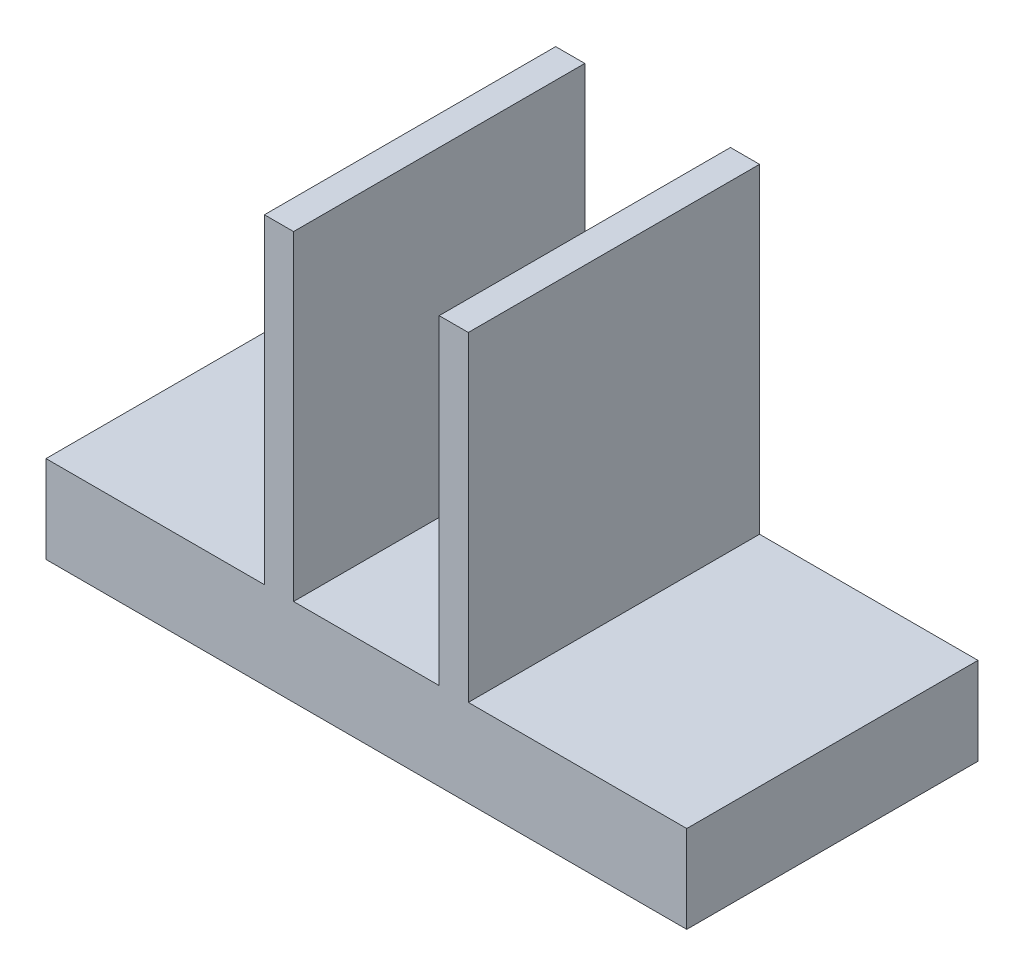
ISO-10303-21;
HEADER;
FILE_DESCRIPTION(('STEP AP214'),'2;1');
FILE_NAME('part.step','',(''),(''),'','','');
FILE_SCHEMA(('AUTOMOTIVE_DESIGN { 1 0 10303 214 1 1 1 1 }'));
ENDSEC;
DATA;
#1=APPLICATION_CONTEXT('core data for automotive mechanical design processes');
#2=APPLICATION_PROTOCOL_DEFINITION('international standard','automotive_design',2000,#1);
#3=PRODUCT_CONTEXT('',#1,'mechanical');
#4=PRODUCT('Part','Part','',(#3));
#5=PRODUCT_RELATED_PRODUCT_CATEGORY('part','',(#4));
#6=PRODUCT_DEFINITION_FORMATION('','',#4);
#7=PRODUCT_DEFINITION_CONTEXT('part definition',#1,'design');
#8=PRODUCT_DEFINITION('design','',#6,#7);
#9=PRODUCT_DEFINITION_SHAPE('','',#8);
#10=(LENGTH_UNIT() NAMED_UNIT(*) SI_UNIT(.MILLI.,.METRE.));
#11=(NAMED_UNIT(*) PLANE_ANGLE_UNIT() SI_UNIT($,.RADIAN.));
#12=(NAMED_UNIT(*) SI_UNIT($,.STERADIAN.) SOLID_ANGLE_UNIT());
#13=UNCERTAINTY_MEASURE_WITH_UNIT(LENGTH_MEASURE(1.E-05),#10,'distance_accuracy_value','');
#14=(GEOMETRIC_REPRESENTATION_CONTEXT(3) GLOBAL_UNCERTAINTY_ASSIGNED_CONTEXT((#13)) GLOBAL_UNIT_ASSIGNED_CONTEXT((#10,
#11,#12)) REPRESENTATION_CONTEXT('',''));
#15=CARTESIAN_POINT('',(0.,0.,0.));
#16=DIRECTION('',(0.,0.,1.));
#17=DIRECTION('',(1.,0.,0.));
#18=AXIS2_PLACEMENT_3D('',#15,#16,#17);
#19=CARTESIAN_POINT('',(0.,0.,10.));
#20=DIRECTION('',(1.,0.,0.));
#21=DIRECTION('',(0.,0.,-1.));
#22=AXIS2_PLACEMENT_3D('',#19,#20,#21);
#23=PLANE('',#22);
#24=DIRECTION('',(0.,-1.,0.));
#25=VECTOR('',#24,1.);
#26=CARTESIAN_POINT('',(0.,0.,0.));
#27=LINE('',#26,#25);
#28=CARTESIAN_POINT('',(0.,3.,0.));
#29=VERTEX_POINT('',#28);
#30=CARTESIAN_POINT('',(0.,0.,0.));
#31=VERTEX_POINT('',#30);
#32=EDGE_CURVE('E163',#29,#31,#27,.T.);
#33=ORIENTED_EDGE('',*,*,#32,.T.);
#34=DIRECTION('',(0.,0.,-1.));
#35=VECTOR('',#34,1.);
#36=CARTESIAN_POINT('',(0.,0.,10.));
#37=LINE('',#36,#35);
#38=CARTESIAN_POINT('',(0.,0.,10.));
#39=VERTEX_POINT('',#38);
#40=EDGE_CURVE('E11',#39,#31,#37,.T.);
#41=ORIENTED_EDGE('',*,*,#40,.F.);
#42=DIRECTION('',(0.,-1.,0.));
#43=VECTOR('',#42,1.);
#44=CARTESIAN_POINT('',(0.,0.,10.));
#45=LINE('',#44,#43);
#46=CARTESIAN_POINT('',(0.,3.,10.));
#47=VERTEX_POINT('',#46);
#48=EDGE_CURVE('E185',#47,#39,#45,.T.);
#49=ORIENTED_EDGE('',*,*,#48,.F.);
#50=DIRECTION('',(0.,0.,-1.));
#51=VECTOR('',#50,1.);
#52=CARTESIAN_POINT('',(0.,3.,10.));
#53=LINE('',#52,#51);
#54=EDGE_CURVE('E159',#47,#29,#53,.T.);
#55=ORIENTED_EDGE('',*,*,#54,.T.);
#56=EDGE_LOOP('',(#33,#41,#49,#55));
#57=FACE_BOUND('',#56,.T.);
#58=ADVANCED_FACE('F43',(#57),#23,.F.);
#59=CARTESIAN_POINT('',(0.,0.,10.));
#60=DIRECTION('',(0.,1.,0.));
#61=DIRECTION('',(0.,0.,1.));
#62=AXIS2_PLACEMENT_3D('',#59,#60,#61);
#63=PLANE('',#62);
#64=DIRECTION('',(1.,0.,0.));
#65=VECTOR('',#64,1.);
#66=CARTESIAN_POINT('',(0.,0.,0.));
#67=LINE('',#66,#65);
#68=CARTESIAN_POINT('',(22.,0.,0.));
#69=VERTEX_POINT('',#68);
#70=EDGE_CURVE('E166',#31,#69,#67,.T.);
#71=ORIENTED_EDGE('',*,*,#70,.T.);
#72=DIRECTION('',(0.,0.,-1.));
#73=VECTOR('',#72,1.);
#74=CARTESIAN_POINT('',(22.,0.,10.));
#75=LINE('',#74,#73);
#76=CARTESIAN_POINT('',(22.,0.,10.));
#77=VERTEX_POINT('',#76);
#78=EDGE_CURVE('E51',#77,#69,#75,.T.);
#79=ORIENTED_EDGE('',*,*,#78,.F.);
#80=DIRECTION('',(1.,0.,0.));
#81=VECTOR('',#80,1.);
#82=CARTESIAN_POINT('',(0.,0.,10.));
#83=LINE('',#82,#81);
#84=EDGE_CURVE('E114',#39,#77,#83,.T.);
#85=ORIENTED_EDGE('',*,*,#84,.F.);
#86=ORIENTED_EDGE('',*,*,#40,.T.);
#87=EDGE_LOOP('',(#71,#79,#85,#86));
#88=FACE_BOUND('',#87,.T.);
#89=ADVANCED_FACE('F263',(#88),#63,.F.);
#90=CARTESIAN_POINT('',(22.,0.,10.));
#91=DIRECTION('',(-1.,0.,0.));
#92=DIRECTION('',(0.,0.,1.));
#93=AXIS2_PLACEMENT_3D('',#90,#91,#92);
#94=PLANE('',#93);
#95=DIRECTION('',(0.,1.,0.));
#96=VECTOR('',#95,1.);
#97=CARTESIAN_POINT('',(22.,0.,0.));
#98=LINE('',#97,#96);
#99=CARTESIAN_POINT('',(22.,3.,0.));
#100=VERTEX_POINT('',#99);
#101=EDGE_CURVE('E168',#69,#100,#98,.T.);
#102=ORIENTED_EDGE('',*,*,#101,.T.);
#103=DIRECTION('',(0.,0.,-1.));
#104=VECTOR('',#103,1.);
#105=CARTESIAN_POINT('',(22.,3.,10.));
#106=LINE('',#105,#104);
#107=CARTESIAN_POINT('',(22.,3.,10.));
#108=VERTEX_POINT('',#107);
#109=EDGE_CURVE('E204',#108,#100,#106,.T.);
#110=ORIENTED_EDGE('',*,*,#109,.F.);
#111=DIRECTION('',(0.,1.,0.));
#112=VECTOR('',#111,1.);
#113=CARTESIAN_POINT('',(22.,0.,10.));
#114=LINE('',#113,#112);
#115=EDGE_CURVE('E212',#77,#108,#114,.T.);
#116=ORIENTED_EDGE('',*,*,#115,.F.);
#117=ORIENTED_EDGE('',*,*,#78,.T.);
#118=EDGE_LOOP('',(#102,#110,#116,#117));
#119=FACE_BOUND('',#118,.T.);
#120=ADVANCED_FACE('F210',(#119),#94,.F.);
#121=CARTESIAN_POINT('',(22.,3.,10.));
#122=DIRECTION('',(0.,-1.,0.));
#123=DIRECTION('',(1.,0.,0.));
#124=AXIS2_PLACEMENT_3D('',#121,#122,#123);
#125=PLANE('',#124);
#126=DIRECTION('',(-1.,0.,0.));
#127=VECTOR('',#126,1.);
#128=CARTESIAN_POINT('',(22.,3.,0.));
#129=LINE('',#128,#127);
#130=CARTESIAN_POINT('',(14.5,3.,0.));
#131=VERTEX_POINT('',#130);
#132=EDGE_CURVE('E170',#100,#131,#129,.T.);
#133=ORIENTED_EDGE('',*,*,#132,.T.);
#134=DIRECTION('',(0.,0.,-1.));
#135=VECTOR('',#134,1.);
#136=CARTESIAN_POINT('',(14.5,3.,10.));
#137=LINE('',#136,#135);
#138=CARTESIAN_POINT('',(14.5,3.,10.));
#139=VERTEX_POINT('',#138);
#140=EDGE_CURVE('E201',#139,#131,#137,.T.);
#141=ORIENTED_EDGE('',*,*,#140,.F.);
#142=DIRECTION('',(-1.,0.,0.));
#143=VECTOR('',#142,1.);
#144=CARTESIAN_POINT('',(22.,3.,10.));
#145=LINE('',#144,#143);
#146=EDGE_CURVE('E230',#108,#139,#145,.T.);
#147=ORIENTED_EDGE('',*,*,#146,.F.);
#148=ORIENTED_EDGE('',*,*,#109,.T.);
#149=EDGE_LOOP('',(#133,#141,#147,#148));
#150=FACE_BOUND('',#149,.T.);
#151=ADVANCED_FACE('F221',(#150),#125,.F.);
#152=CARTESIAN_POINT('',(14.5,3.,10.));
#153=DIRECTION('',(-1.,0.,0.));
#154=DIRECTION('',(0.,0.,1.));
#155=AXIS2_PLACEMENT_3D('',#152,#153,#154);
#156=PLANE('',#155);
#157=DIRECTION('',(0.,1.,0.));
#158=VECTOR('',#157,1.);
#159=CARTESIAN_POINT('',(14.5,3.,0.));
#160=LINE('',#159,#158);
#161=CARTESIAN_POINT('',(14.5,14.,0.));
#162=VERTEX_POINT('',#161);
#163=EDGE_CURVE('E172',#131,#162,#160,.T.);
#164=ORIENTED_EDGE('',*,*,#163,.T.);
#165=DIRECTION('',(0.,0.,-1.));
#166=VECTOR('',#165,1.);
#167=CARTESIAN_POINT('',(14.5,14.,10.));
#168=LINE('',#167,#166);
#169=CARTESIAN_POINT('',(14.5,14.,10.));
#170=VERTEX_POINT('',#169);
#171=EDGE_CURVE('E198',#170,#162,#168,.T.);
#172=ORIENTED_EDGE('',*,*,#171,.F.);
#173=DIRECTION('',(0.,1.,0.));
#174=VECTOR('',#173,1.);
#175=CARTESIAN_POINT('',(14.5,3.,10.));
#176=LINE('',#175,#174);
#177=EDGE_CURVE('E227',#139,#170,#176,.T.);
#178=ORIENTED_EDGE('',*,*,#177,.F.);
#179=ORIENTED_EDGE('',*,*,#140,.T.);
#180=EDGE_LOOP('',(#164,#172,#178,#179));
#181=FACE_BOUND('',#180,.T.);
#182=ADVANCED_FACE('F225',(#181),#156,.F.);
#183=CARTESIAN_POINT('',(14.5,14.,10.));
#184=DIRECTION('',(0.,-1.,0.));
#185=DIRECTION('',(0.,0.,-1.));
#186=AXIS2_PLACEMENT_3D('',#183,#184,#185);
#187=PLANE('',#186);
#188=DIRECTION('',(-1.,0.,0.));
#189=VECTOR('',#188,1.);
#190=CARTESIAN_POINT('',(14.5,14.,0.));
#191=LINE('',#190,#189);
#192=CARTESIAN_POINT('',(13.5,14.,0.));
#193=VERTEX_POINT('',#192);
#194=EDGE_CURVE('E174',#162,#193,#191,.T.);
#195=ORIENTED_EDGE('',*,*,#194,.T.);
#196=DIRECTION('',(0.,0.,-1.));
#197=VECTOR('',#196,1.);
#198=CARTESIAN_POINT('',(13.5,14.,10.));
#199=LINE('',#198,#197);
#200=CARTESIAN_POINT('',(13.5,14.,10.));
#201=VERTEX_POINT('',#200);
#202=EDGE_CURVE('E195',#201,#193,#199,.T.);
#203=ORIENTED_EDGE('',*,*,#202,.F.);
#204=DIRECTION('',(-1.,0.,0.));
#205=VECTOR('',#204,1.);
#206=CARTESIAN_POINT('',(14.5,14.,10.));
#207=LINE('',#206,#205);
#208=EDGE_CURVE('E229',#170,#201,#207,.T.);
#209=ORIENTED_EDGE('',*,*,#208,.F.);
#210=ORIENTED_EDGE('',*,*,#171,.T.);
#211=EDGE_LOOP('',(#195,#203,#209,#210));
#212=FACE_BOUND('',#211,.T.);
#213=ADVANCED_FACE('F276',(#212),#187,.F.);
#214=CARTESIAN_POINT('',(13.5,14.,10.));
#215=DIRECTION('',(1.,0.,0.));
#216=DIRECTION('',(0.,0.,-1.));
#217=AXIS2_PLACEMENT_3D('',#214,#215,#216);
#218=PLANE('',#217);
#219=DIRECTION('',(0.,-1.,0.));
#220=VECTOR('',#219,1.);
#221=CARTESIAN_POINT('',(13.5,14.,0.));
#222=LINE('',#221,#220);
#223=CARTESIAN_POINT('',(13.5,3.,0.));
#224=VERTEX_POINT('',#223);
#225=EDGE_CURVE('E176',#193,#224,#222,.T.);
#226=ORIENTED_EDGE('',*,*,#225,.T.);
#227=DIRECTION('',(0.,0.,-1.));
#228=VECTOR('',#227,1.);
#229=CARTESIAN_POINT('',(13.5,3.,10.));
#230=LINE('',#229,#228);
#231=CARTESIAN_POINT('',(13.5,3.,10.));
#232=VERTEX_POINT('',#231);
#233=EDGE_CURVE('E192',#232,#224,#230,.T.);
#234=ORIENTED_EDGE('',*,*,#233,.F.);
#235=DIRECTION('',(0.,-1.,0.));
#236=VECTOR('',#235,1.);
#237=CARTESIAN_POINT('',(13.5,14.,10.));
#238=LINE('',#237,#236);
#239=EDGE_CURVE('E232',#201,#232,#238,.T.);
#240=ORIENTED_EDGE('',*,*,#239,.F.);
#241=ORIENTED_EDGE('',*,*,#202,.T.);
#242=EDGE_LOOP('',(#226,#234,#240,#241));
#243=FACE_BOUND('',#242,.T.);
#244=ADVANCED_FACE('F279',(#243),#218,.F.);
#245=CARTESIAN_POINT('',(8.5,3.,10.));
#246=DIRECTION('',(0.,-1.,0.));
#247=DIRECTION('',(1.,0.,0.));
#248=AXIS2_PLACEMENT_3D('',#245,#246,#247);
#249=PLANE('',#248);
#250=DIRECTION('',(-1.,0.,0.));
#251=VECTOR('',#250,1.);
#252=CARTESIAN_POINT('',(8.5,3.,0.));
#253=LINE('',#252,#251);
#254=CARTESIAN_POINT('',(8.5,3.,0.));
#255=VERTEX_POINT('',#254);
#256=EDGE_CURVE('E178',#224,#255,#253,.T.);
#257=ORIENTED_EDGE('',*,*,#256,.T.);
#258=DIRECTION('',(0.,0.,-1.));
#259=VECTOR('',#258,1.);
#260=CARTESIAN_POINT('',(8.5,3.,10.));
#261=LINE('',#260,#259);
#262=CARTESIAN_POINT('',(8.5,3.,10.));
#263=VERTEX_POINT('',#262);
#264=EDGE_CURVE('E189',#263,#255,#261,.T.);
#265=ORIENTED_EDGE('',*,*,#264,.F.);
#266=DIRECTION('',(-1.,0.,0.));
#267=VECTOR('',#266,1.);
#268=CARTESIAN_POINT('',(8.5,3.,10.));
#269=LINE('',#268,#267);
#270=EDGE_CURVE('E238',#232,#263,#269,.T.);
#271=ORIENTED_EDGE('',*,*,#270,.F.);
#272=ORIENTED_EDGE('',*,*,#233,.T.);
#273=EDGE_LOOP('',(#257,#265,#271,#272));
#274=FACE_BOUND('',#273,.T.);
#275=ADVANCED_FACE('F244',(#274),#249,.F.);
#276=CARTESIAN_POINT('',(8.5,14.,10.));
#277=DIRECTION('',(-1.,0.,0.));
#278=DIRECTION('',(0.,0.,1.));
#279=AXIS2_PLACEMENT_3D('',#276,#277,#278);
#280=PLANE('',#279);
#281=DIRECTION('',(0.,1.,0.));
#282=VECTOR('',#281,1.);
#283=CARTESIAN_POINT('',(8.5,14.,0.));
#284=LINE('',#283,#282);
#285=CARTESIAN_POINT('',(8.5,14.,0.));
#286=VERTEX_POINT('',#285);
#287=EDGE_CURVE('E180',#255,#286,#284,.T.);
#288=ORIENTED_EDGE('',*,*,#287,.T.);
#289=DIRECTION('',(0.,0.,-1.));
#290=VECTOR('',#289,1.);
#291=CARTESIAN_POINT('',(8.5,14.,10.));
#292=LINE('',#291,#290);
#293=CARTESIAN_POINT('',(8.5,14.,10.));
#294=VERTEX_POINT('',#293);
#295=EDGE_CURVE('E154',#294,#286,#292,.T.);
#296=ORIENTED_EDGE('',*,*,#295,.F.);
#297=DIRECTION('',(0.,1.,0.));
#298=VECTOR('',#297,1.);
#299=CARTESIAN_POINT('',(8.5,14.,10.));
#300=LINE('',#299,#298);
#301=EDGE_CURVE('E145',#263,#294,#300,.T.);
#302=ORIENTED_EDGE('',*,*,#301,.F.);
#303=ORIENTED_EDGE('',*,*,#264,.T.);
#304=EDGE_LOOP('',(#288,#296,#302,#303));
#305=FACE_BOUND('',#304,.T.);
#306=ADVANCED_FACE('F248',(#305),#280,.F.);
#307=CARTESIAN_POINT('',(7.5,14.,10.));
#308=DIRECTION('',(0.,-1.,0.));
#309=DIRECTION('',(0.,0.,-1.));
#310=AXIS2_PLACEMENT_3D('',#307,#308,#309);
#311=PLANE('',#310);
#312=DIRECTION('',(-1.,0.,0.));
#313=VECTOR('',#312,1.);
#314=CARTESIAN_POINT('',(7.5,14.,0.));
#315=LINE('',#314,#313);
#316=CARTESIAN_POINT('',(7.5,14.,0.));
#317=VERTEX_POINT('',#316);
#318=EDGE_CURVE('E153',#286,#317,#315,.T.);
#319=ORIENTED_EDGE('',*,*,#318,.T.);
#320=DIRECTION('',(0.,0.,-1.));
#321=VECTOR('',#320,1.);
#322=CARTESIAN_POINT('',(7.5,14.,10.));
#323=LINE('',#322,#321);
#324=CARTESIAN_POINT('',(7.5,14.,10.));
#325=VERTEX_POINT('',#324);
#326=EDGE_CURVE('E150',#325,#317,#323,.T.);
#327=ORIENTED_EDGE('',*,*,#326,.F.);
#328=DIRECTION('',(-1.,0.,0.));
#329=VECTOR('',#328,1.);
#330=CARTESIAN_POINT('',(7.5,14.,10.));
#331=LINE('',#330,#329);
#332=EDGE_CURVE('E139',#294,#325,#331,.T.);
#333=ORIENTED_EDGE('',*,*,#332,.F.);
#334=ORIENTED_EDGE('',*,*,#295,.T.);
#335=EDGE_LOOP('',(#319,#327,#333,#334));
#336=FACE_BOUND('',#335,.T.);
#337=ADVANCED_FACE('F151',(#336),#311,.F.);
#338=CARTESIAN_POINT('',(7.5,3.,10.));
#339=DIRECTION('',(1.,0.,0.));
#340=DIRECTION('',(0.,0.,-1.));
#341=AXIS2_PLACEMENT_3D('',#338,#339,#340);
#342=PLANE('',#341);
#343=DIRECTION('',(0.,-1.,0.));
#344=VECTOR('',#343,1.);
#345=CARTESIAN_POINT('',(7.5,3.,0.));
#346=LINE('',#345,#344);
#347=CARTESIAN_POINT('',(7.5,3.,0.));
#348=VERTEX_POINT('',#347);
#349=EDGE_CURVE('E100',#317,#348,#346,.T.);
#350=ORIENTED_EDGE('',*,*,#349,.T.);
#351=DIRECTION('',(0.,0.,-1.));
#352=VECTOR('',#351,1.);
#353=CARTESIAN_POINT('',(7.5,3.,10.));
#354=LINE('',#353,#352);
#355=CARTESIAN_POINT('',(7.5,3.,10.));
#356=VERTEX_POINT('',#355);
#357=EDGE_CURVE('E155',#356,#348,#354,.T.);
#358=ORIENTED_EDGE('',*,*,#357,.F.);
#359=DIRECTION('',(0.,-1.,0.));
#360=VECTOR('',#359,1.);
#361=CARTESIAN_POINT('',(7.5,3.,10.));
#362=LINE('',#361,#360);
#363=EDGE_CURVE('E143',#325,#356,#362,.T.);
#364=ORIENTED_EDGE('',*,*,#363,.F.);
#365=ORIENTED_EDGE('',*,*,#326,.T.);
#366=EDGE_LOOP('',(#350,#358,#364,#365));
#367=FACE_BOUND('',#366,.T.);
#368=ADVANCED_FACE('F157',(#367),#342,.F.);
#369=CARTESIAN_POINT('',(0.,3.,10.));
#370=DIRECTION('',(0.,-1.,0.));
#371=DIRECTION('',(0.,0.,-1.));
#372=AXIS2_PLACEMENT_3D('',#369,#370,#371);
#373=PLANE('',#372);
#374=DIRECTION('',(-1.,0.,0.));
#375=VECTOR('',#374,1.);
#376=CARTESIAN_POINT('',(0.,3.,0.));
#377=LINE('',#376,#375);
#378=EDGE_CURVE('E106',#348,#29,#377,.T.);
#379=ORIENTED_EDGE('',*,*,#378,.T.);
#380=ORIENTED_EDGE('',*,*,#54,.F.);
#381=DIRECTION('',(-1.,0.,0.));
#382=VECTOR('',#381,1.);
#383=CARTESIAN_POINT('',(0.,3.,10.));
#384=LINE('',#383,#382);
#385=EDGE_CURVE('E59',#356,#47,#384,.T.);
#386=ORIENTED_EDGE('',*,*,#385,.F.);
#387=ORIENTED_EDGE('',*,*,#357,.T.);
#388=EDGE_LOOP('',(#379,#380,#386,#387));
#389=FACE_BOUND('',#388,.T.);
#390=ADVANCED_FACE('F252',(#389),#373,.F.);
#391=CARTESIAN_POINT('',(0.,0.,10.));
#392=DIRECTION('',(0.,0.,-1.));
#393=DIRECTION('',(-1.,0.,0.));
#394=AXIS2_PLACEMENT_3D('',#391,#392,#393);
#395=PLANE('',#394);
#396=ORIENTED_EDGE('',*,*,#48,.T.);
#397=ORIENTED_EDGE('',*,*,#84,.T.);
#398=ORIENTED_EDGE('',*,*,#115,.T.);
#399=ORIENTED_EDGE('',*,*,#146,.T.);
#400=ORIENTED_EDGE('',*,*,#177,.T.);
#401=ORIENTED_EDGE('',*,*,#208,.T.);
#402=ORIENTED_EDGE('',*,*,#239,.T.);
#403=ORIENTED_EDGE('',*,*,#270,.T.);
#404=ORIENTED_EDGE('',*,*,#301,.T.);
#405=ORIENTED_EDGE('',*,*,#332,.T.);
#406=ORIENTED_EDGE('',*,*,#363,.T.);
#407=ORIENTED_EDGE('',*,*,#385,.T.);
#408=EDGE_LOOP('',(#396,#397,#398,#399,#400,#401,#402,#403,#404,#405,#406,#407));
#409=FACE_BOUND('',#408,.T.);
#410=ADVANCED_FACE('F141',(#409),#395,.F.);
#411=CARTESIAN_POINT('',(0.,0.,0.));
#412=DIRECTION('',(0.,0.,-1.));
#413=DIRECTION('',(-1.,0.,0.));
#414=AXIS2_PLACEMENT_3D('',#411,#412,#413);
#415=PLANE('',#414);
#416=ORIENTED_EDGE('',*,*,#32,.F.);
#417=ORIENTED_EDGE('',*,*,#378,.F.);
#418=ORIENTED_EDGE('',*,*,#349,.F.);
#419=ORIENTED_EDGE('',*,*,#318,.F.);
#420=ORIENTED_EDGE('',*,*,#287,.F.);
#421=ORIENTED_EDGE('',*,*,#256,.F.);
#422=ORIENTED_EDGE('',*,*,#225,.F.);
#423=ORIENTED_EDGE('',*,*,#194,.F.);
#424=ORIENTED_EDGE('',*,*,#163,.F.);
#425=ORIENTED_EDGE('',*,*,#132,.F.);
#426=ORIENTED_EDGE('',*,*,#101,.F.);
#427=ORIENTED_EDGE('',*,*,#70,.F.);
#428=EDGE_LOOP('',(#416,#417,#418,#419,#420,#421,#422,#423,#424,#425,#426,#427));
#429=FACE_BOUND('',#428,.T.);
#430=ADVANCED_FACE('F216',(#429),#415,.T.);
#431=CLOSED_SHELL('',(#58,#89,#120,#151,#182,#213,#244,#275,#306,#337,#368,#390,#410,#430));
#432=MANIFOLD_SOLID_BREP('B2',#431);
#433=ADVANCED_BREP_SHAPE_REPRESENTATION('',(#18,#432),#14);
#434=SHAPE_DEFINITION_REPRESENTATION(#9,#433);
ENDSEC;
END-ISO-10303-21;
